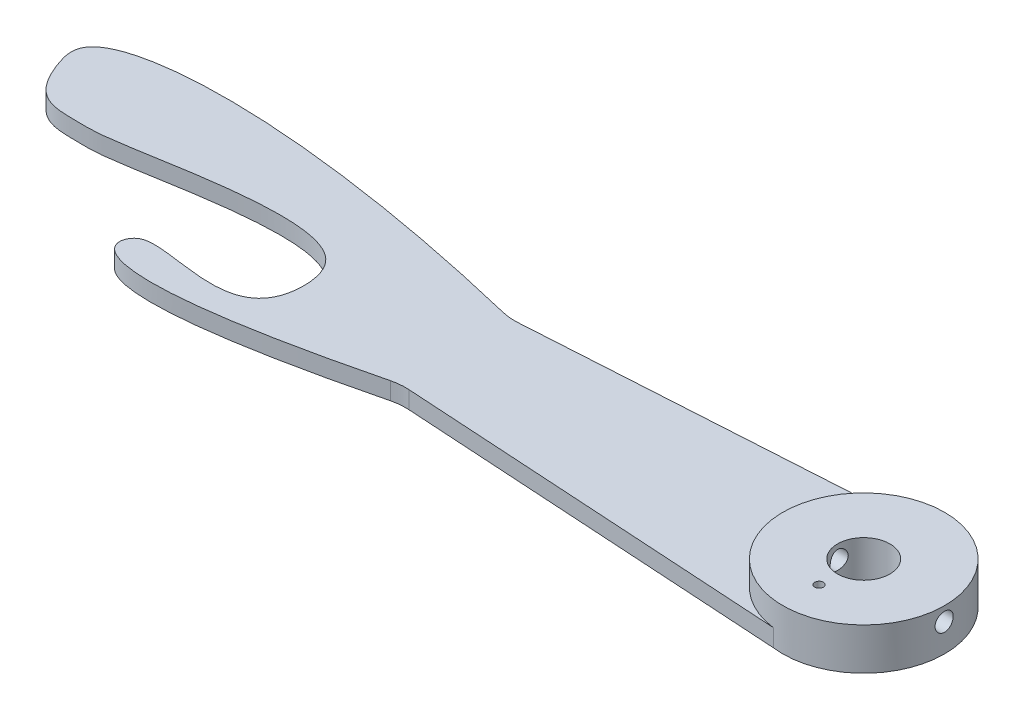
ISO-10303-21;
HEADER;
FILE_DESCRIPTION(('STEP AP214'),'2;1');
FILE_NAME('part.step','',(''),(''),'','','');
FILE_SCHEMA(('AUTOMOTIVE_DESIGN { 1 0 10303 214 1 1 1 1 }'));
ENDSEC;
DATA;
#1=APPLICATION_CONTEXT('core data for automotive mechanical design processes');
#2=APPLICATION_PROTOCOL_DEFINITION('international standard','automotive_design',2000,#1);
#3=PRODUCT_CONTEXT('',#1,'mechanical');
#4=PRODUCT('Part','Part','',(#3));
#5=PRODUCT_RELATED_PRODUCT_CATEGORY('part','',(#4));
#6=PRODUCT_DEFINITION_FORMATION('','',#4);
#7=PRODUCT_DEFINITION_CONTEXT('part definition',#1,'design');
#8=PRODUCT_DEFINITION('design','',#6,#7);
#9=PRODUCT_DEFINITION_SHAPE('','',#8);
#10=(LENGTH_UNIT() NAMED_UNIT(*) SI_UNIT(.MILLI.,.METRE.));
#11=(NAMED_UNIT(*) PLANE_ANGLE_UNIT() SI_UNIT($,.RADIAN.));
#12=(NAMED_UNIT(*) SI_UNIT($,.STERADIAN.) SOLID_ANGLE_UNIT());
#13=UNCERTAINTY_MEASURE_WITH_UNIT(LENGTH_MEASURE(1.E-05),#10,'distance_accuracy_value','');
#14=(GEOMETRIC_REPRESENTATION_CONTEXT(3) GLOBAL_UNCERTAINTY_ASSIGNED_CONTEXT((#13)) GLOBAL_UNIT_ASSIGNED_CONTEXT((#10,
#11,#12)) REPRESENTATION_CONTEXT('',''));
#15=CARTESIAN_POINT('',(0.,0.,0.));
#16=DIRECTION('',(0.,0.,1.));
#17=DIRECTION('',(1.,0.,0.));
#18=AXIS2_PLACEMENT_3D('',#15,#16,#17);
#19=CARTESIAN_POINT('',(-45.2064522020592,1.5875,-7.42970056120093));
#20=CARTESIAN_POINT('',(-68.7385230658082,1.5875,-1.55220301449873));
#21=CARTESIAN_POINT('',(-69.2548977062567,1.5875,-6.74334430708416));
#22=CARTESIAN_POINT('',(-65.4032652880408,1.5875,-8.16874151774842));
#23=CARTESIAN_POINT('',(-55.6776328197433,1.5875,-4.25533451918402));
#24=CARTESIAN_POINT('',(-57.3220849406949,1.5875,-18.1406564123138));
#25=CARTESIAN_POINT('',(-75.9393371187743,1.5875,-13.4654942069597));
#26=CARTESIAN_POINT('',(-81.606998932444,1.5875,-13.7017175286145));
#27=CARTESIAN_POINT('',(-84.3052630331315,1.5875,-13.4032317419072));
#28=CARTESIAN_POINT('',(-86.882917877035,1.5875,-22.6760988597324));
#29=CARTESIAN_POINT('',(-69.3318028641538,1.5875,-23.7112984969501));
#30=CARTESIAN_POINT('',(-45.4543996597082,1.5875,-17.9520244146589));
#31=B_SPLINE_CURVE_WITH_KNOTS('',3,(#19,#20,#21,#22,#23,#24,#25,#26,#27,#28,#29,#30),
.UNSPECIFIED.,.F.,.F.,(4,1,1,1,1,1,1,1,1,4),(0.00152699221827778,0.145525509120552,
0.192265368960274,0.438185565987141,0.489914764133591,0.657828152278324,0.698156079835028,
0.852866112143922,0.884867633334752,0.99883253770472),.UNSPECIFIED.);
#32=DIRECTION('',(0.,-1.,0.));
#33=VECTOR('',#32,1.);
#34=SURFACE_OF_LINEAR_EXTRUSION('',#31,#33);
#35=CARTESIAN_POINT('',(-45.2064522020592,0.,-7.42970056120093));
#36=CARTESIAN_POINT('',(-68.7385230658082,0.,-1.55220301449873));
#37=CARTESIAN_POINT('',(-69.2548977062567,0.,-6.74334430708416));
#38=CARTESIAN_POINT('',(-65.4032652880408,0.,-8.16874151774842));
#39=CARTESIAN_POINT('',(-55.6776328197433,0.,-4.25533451918402));
#40=CARTESIAN_POINT('',(-57.3220849406949,0.,-18.1406564123138));
#41=CARTESIAN_POINT('',(-75.9393371187743,0.,-13.4654942069597));
#42=CARTESIAN_POINT('',(-81.606998932444,0.,-13.7017175286145));
#43=CARTESIAN_POINT('',(-84.3052630331315,0.,-13.4032317419072));
#44=CARTESIAN_POINT('',(-86.882917877035,0.,-22.6760988597324));
#45=CARTESIAN_POINT('',(-69.3318028641538,0.,-23.7112984969501));
#46=CARTESIAN_POINT('',(-45.4543996597082,0.,-17.9520244146589));
#47=B_SPLINE_CURVE_WITH_KNOTS('',3,(#35,#36,#37,#38,#39,#40,#41,#42,#43,#44,#45,#46),
.UNSPECIFIED.,.F.,.F.,(4,1,1,1,1,1,1,1,1,4),(0.00152699221827778,0.145525509120552,
0.192265368960274,0.438185565987141,0.489914764133591,0.657828152278324,0.698156079835028,
0.852866112143922,0.884867633334752,0.99883253770472),.UNSPECIFIED.);
#48=CARTESIAN_POINT('',(-45.2064522020592,0.,-7.42970056120093));
#49=VERTEX_POINT('',#48);
#50=CARTESIAN_POINT('',(-45.4543996597082,0.,-17.9520244146589));
#51=VERTEX_POINT('',#50);
#52=EDGE_CURVE('E122',#49,#51,#47,.T.);
#53=ORIENTED_EDGE('',*,*,#52,.F.);
#54=DIRECTION('',(0.,-1.,0.));
#55=VECTOR('',#54,1.);
#56=CARTESIAN_POINT('',(-45.2064522020592,1.5875,-7.42970056120093));
#57=LINE('',#56,#55);
#58=CARTESIAN_POINT('',(-45.2064522020592,1.5875,-7.42970056120093));
#59=VERTEX_POINT('',#58);
#60=EDGE_CURVE('E12',#59,#49,#57,.T.);
#61=ORIENTED_EDGE('',*,*,#60,.F.);
#62=CARTESIAN_POINT('',(-45.4543996597082,1.5875,-17.9520244146589));
#63=VERTEX_POINT('',#62);
#64=EDGE_CURVE('E175',#59,#63,#31,.T.);
#65=ORIENTED_EDGE('',*,*,#64,.T.);
#66=DIRECTION('',(0.,-1.,0.));
#67=VECTOR('',#66,1.);
#68=CARTESIAN_POINT('',(-45.4543996597082,1.5875,-17.9520244146589));
#69=LINE('',#68,#67);
#70=EDGE_CURVE('E151',#63,#51,#69,.T.);
#71=ORIENTED_EDGE('',*,*,#70,.T.);
#72=EDGE_LOOP('',(#53,#61,#65,#71));
#73=FACE_BOUND('',#72,.T.);
#74=ADVANCED_FACE('F45',(#73),#34,.T.);
#75=CARTESIAN_POINT('',(-43.9754594012535,1.5875,-2.50110474450379));
#76=DIRECTION('',(0.,-1.,0.));
#77=DIRECTION('',(0.,0.,-1.));
#78=AXIS2_PLACEMENT_3D('',#75,#76,#77);
#79=CYLINDRICAL_SURFACE('',#78,5.08);
#80=CARTESIAN_POINT('',(-43.9754594012535,0.,-2.50110474450379));
#81=DIRECTION('',(0.,1.,0.));
#82=DIRECTION('',(0.,0.,1.));
#83=AXIS2_PLACEMENT_3D('',#80,#81,#82);
#84=CIRCLE('',#83,5.08);
#85=CARTESIAN_POINT('',(-43.6629020064214,0.,-7.5714802606698));
#86=VERTEX_POINT('',#85);
#87=EDGE_CURVE('E157',#49,#86,#84,.F.);
#88=ORIENTED_EDGE('',*,*,#87,.T.);
#89=DIRECTION('',(0.,-1.,0.));
#90=VECTOR('',#89,1.);
#91=CARTESIAN_POINT('',(-43.6629020064214,1.5875,-7.5714802606698));
#92=LINE('',#91,#90);
#93=CARTESIAN_POINT('',(-43.6629020064214,1.5875,-7.5714802606698));
#94=VERTEX_POINT('',#93);
#95=EDGE_CURVE('E60',#94,#86,#92,.T.);
#96=ORIENTED_EDGE('',*,*,#95,.F.);
#97=CARTESIAN_POINT('',(-43.9754594012535,1.5875,-2.50110474450379));
#98=DIRECTION('',(0.,1.,0.));
#99=DIRECTION('',(0.,0.,1.));
#100=AXIS2_PLACEMENT_3D('',#97,#98,#99);
#101=CIRCLE('',#100,5.08);
#102=EDGE_CURVE('E110',#59,#94,#101,.F.);
#103=ORIENTED_EDGE('',*,*,#102,.F.);
#104=ORIENTED_EDGE('',*,*,#60,.T.);
#105=EDGE_LOOP('',(#88,#96,#103,#104));
#106=FACE_BOUND('',#105,.T.);
#107=ADVANCED_FACE('F380',(#106),#79,.F.);
#108=CARTESIAN_POINT('',(0.299678926952375,1.5875,-4.86145814833854));
#109=DIRECTION('',(0.0615270462268013,0.,-0.998105416568112));
#110=DIRECTION('',(-0.998105416568112,0.,-0.0615270462268013));
#111=AXIS2_PLACEMENT_3D('',#108,#109,#110);
#112=PLANE('',#111);
#113=DIRECTION('',(0.998105416568112,0.,0.0615270462268013));
#114=VECTOR('',#113,1.);
#115=CARTESIAN_POINT('',(0.299678926952375,0.,-4.86145814833854));
#116=LINE('',#115,#114);
#117=CARTESIAN_POINT('',(-8.27069916343413,0.,-5.38976912651305));
#118=VERTEX_POINT('',#117);
#119=EDGE_CURVE('E120',#86,#118,#116,.T.);
#120=ORIENTED_EDGE('',*,*,#119,.T.);
#121=DIRECTION('',(0.,-1.,0.));
#122=VECTOR('',#121,1.);
#123=CARTESIAN_POINT('',(-8.27069916343413,3.81,-5.38976912651305));
#124=LINE('',#123,#122);
#125=CARTESIAN_POINT('',(-8.27069916343413,1.5875,-5.38976912651305));
#126=VERTEX_POINT('',#125);
#127=EDGE_CURVE('E118',#118,#126,#124,.F.);
#128=ORIENTED_EDGE('',*,*,#127,.T.);
#129=DIRECTION('',(0.998105416568112,0.,0.0615270462268013));
#130=VECTOR('',#129,1.);
#131=CARTESIAN_POINT('',(0.299678926952375,1.5875,-4.86145814833854));
#132=LINE('',#131,#130);
#133=EDGE_CURVE('E105',#94,#126,#132,.T.);
#134=ORIENTED_EDGE('',*,*,#133,.F.);
#135=ORIENTED_EDGE('',*,*,#95,.T.);
#136=EDGE_LOOP('',(#120,#128,#134,#135));
#137=FACE_BOUND('',#136,.T.);
#138=ADVANCED_FACE('F119',(#137),#112,.F.);
#139=CARTESIAN_POINT('',(-7.366,1.5875,-12.7));
#140=DIRECTION('',(0.,-1.,0.));
#141=DIRECTION('',(0.,0.,-1.));
#142=AXIS2_PLACEMENT_3D('',#139,#140,#141);
#143=CYLINDRICAL_SURFACE('',#142,7.366);
#144=CARTESIAN_POINT('',(-14.6855973762223,2.54,-13.5255));
#145=CARTESIAN_POINT('',(-14.6855979782766,2.5862122176924,-13.5254980141274));
#146=CARTESIAN_POINT('',(-14.6860397375811,2.63245423075994,-13.521606418294));
#147=CARTESIAN_POINT('',(-14.6877586065931,2.72365397752181,-13.5061421078971));
#148=CARTESIAN_POINT('',(-14.6890366151641,2.7686102749013,-13.4945611280076));
#149=CARTESIAN_POINT('',(-14.6922814465688,2.85590480654257,-13.4640614459201));
#150=CARTESIAN_POINT('',(-14.6942478290321,2.89824469426347,-13.4451474340205));
#151=CARTESIAN_POINT('',(-14.6986473102254,2.97914058466141,-13.4005280886547));
#152=CARTESIAN_POINT('',(-14.7010803221323,3.01769728924068,-13.3748240182427));
#153=CARTESIAN_POINT('',(-14.7061512624519,3.09011548599148,-13.3172293601897));
#154=CARTESIAN_POINT('',(-14.7087899782837,3.12395740000604,-13.2853142222058));
#155=CARTESIAN_POINT('',(-14.7139678956606,3.18581652611943,-13.2162560618126));
#156=CARTESIAN_POINT('',(-14.71650709247,3.2138334613045,-13.1791127910038));
#157=CARTESIAN_POINT('',(-14.7212077996832,3.26331631785724,-13.1005311761301));
#158=CARTESIAN_POINT('',(-14.7233682930559,3.28476471088172,-13.0590817284511));
#159=CARTESIAN_POINT('',(-14.7270595514746,3.32038944988259,-12.9731411641375));
#160=CARTESIAN_POINT('',(-14.7285903355118,3.33456601516875,-12.9286501392791));
#161=CARTESIAN_POINT('',(-14.7308441602775,3.35518670528302,-12.8380884837005));
#162=CARTESIAN_POINT('',(-14.7315705814025,3.36166319878253,-12.7920253087231));
#163=CARTESIAN_POINT('',(-14.7321453520887,3.36680012960659,-12.6994605096559));
#164=CARTESIAN_POINT('',(-14.7319937297866,3.36546081738675,-12.6529588996633));
#165=CARTESIAN_POINT('',(-14.7308322492016,3.35503027678882,-12.5610571978174));
#166=CARTESIAN_POINT('',(-14.7298262446946,3.34597385658352,-12.5156530998215));
#167=CARTESIAN_POINT('',(-14.7270734161751,3.32042048984739,-12.4270133483639));
#168=CARTESIAN_POINT('',(-14.7253265804659,3.30392342583913,-12.3837777291515));
#169=CARTESIAN_POINT('',(-14.721281784899,3.26391942191542,-12.3005934069651));
#170=CARTESIAN_POINT('',(-14.7189826283644,3.24039723383743,-12.2606520975024));
#171=CARTESIAN_POINT('',(-14.7140908349429,3.18702177023156,-12.1852708471787));
#172=CARTESIAN_POINT('',(-14.7114981872365,3.15716826126497,-12.1498310723684));
#173=CARTESIAN_POINT('',(-14.7062931823566,3.09178218898632,-12.0842547334515));
#174=CARTESIAN_POINT('',(-14.7036807951666,3.05621931959844,-12.0541483817625));
#175=CARTESIAN_POINT('',(-14.6987448869194,2.98052865751006,-12.0003278138033));
#176=CARTESIAN_POINT('',(-14.6964213664776,2.94040085508462,-11.9766136111511));
#177=CARTESIAN_POINT('',(-14.6923261840253,2.8566945067779,-11.9362497972332));
#178=CARTESIAN_POINT('',(-14.6905546875046,2.81311493099971,-11.9196023039371));
#179=CARTESIAN_POINT('',(-14.6877674746198,2.72375471473303,-11.8938696859658));
#180=CARTESIAN_POINT('',(-14.6867517291765,2.67797415900471,-11.8847842703199));
#181=CARTESIAN_POINT('',(-14.6855962038138,2.58577748500813,-11.8744730940358));
#182=CARTESIAN_POINT('',(-14.6854517005643,2.53936616347168,-11.8732049521884));
#183=CARTESIAN_POINT('',(-14.6860425453782,2.44699211092224,-11.8784527814034));
#184=CARTESIAN_POINT('',(-14.6867778784432,2.40102937227595,-11.8849686197758));
#185=CARTESIAN_POINT('',(-14.6890412407153,2.31098231060184,-11.9055638866064));
#186=CARTESIAN_POINT('',(-14.6905671463374,2.26689329608804,-11.9196230562382));
#187=CARTESIAN_POINT('',(-14.694238003259,2.18169895179618,-11.9548851376294));
#188=CARTESIAN_POINT('',(-14.6963829722224,2.14059370719669,-11.9760882532318));
#189=CARTESIAN_POINT('',(-14.7010616553228,2.06234120357744,-12.0251416198696));
#190=CARTESIAN_POINT('',(-14.7035969877118,2.02521156460558,-12.0530198225298));
#191=CARTESIAN_POINT('',(-14.7087655369242,1.95614342745834,-12.1145921920756));
#192=CARTESIAN_POINT('',(-14.7113987567954,1.92420509108205,-12.1482865401673));
#193=CARTESIAN_POINT('',(-14.7164807614273,1.86627877749344,-12.2207191873155));
#194=CARTESIAN_POINT('',(-14.7189286523472,1.84031854002071,-12.259479742133));
#195=CARTESIAN_POINT('',(-14.7233510221194,1.7952767036032,-12.3408353825806));
#196=CARTESIAN_POINT('',(-14.7253255088777,1.77619498978584,-12.3834304041595));
#197=CARTESIAN_POINT('',(-14.7285745975419,1.74549832099015,-12.4711511572146));
#198=CARTESIAN_POINT('',(-14.7298507380147,1.73386694202589,-12.5162710820209));
#199=CARTESIAN_POINT('',(-14.7315656977312,1.71834758763597,-12.6078386090367));
#200=CARTESIAN_POINT('',(-14.7320045469667,1.71445933485104,-12.6542861636301));
#201=CARTESIAN_POINT('',(-14.7319954058595,1.71454108557878,-12.7469187535382));
#202=CARTESIAN_POINT('',(-14.7315522602673,1.71846815990525,-12.7931038331654));
#203=CARTESIAN_POINT('',(-14.7298385064783,1.7339786583521,-12.8841535212901));
#204=CARTESIAN_POINT('',(-14.7285678981344,1.74556208383393,-12.9290181295529));
#205=CARTESIAN_POINT('',(-14.7253414585588,1.7760438365449,-13.0161505532006));
#206=CARTESIAN_POINT('',(-14.7233857798587,1.7949405355645,-13.0584189441756));
#207=CARTESIAN_POINT('',(-14.719006539167,1.83950795076021,-13.1391911242864));
#208=CARTESIAN_POINT('',(-14.7165829760905,1.86517868264317,-13.177694904693));
#209=CARTESIAN_POINT('',(-14.7115231173204,1.92272561365091,-13.2500646742507));
#210=CARTESIAN_POINT('',(-14.7088857679289,1.95463379966722,-13.2839051554043));
#211=CARTESIAN_POINT('',(-14.7037043074677,2.02368477616371,-13.3457692078434));
#212=CARTESIAN_POINT('',(-14.7011602187776,2.06082881285048,-13.3737913903532));
#213=CARTESIAN_POINT('',(-14.6964448356879,2.13942769004026,-13.4232957240214));
#214=CARTESIAN_POINT('',(-14.6942747328883,2.18089565767575,-13.4447571332936));
#215=CARTESIAN_POINT('',(-14.6905670849453,2.26684621847608,-13.480382425112));
#216=CARTESIAN_POINT('',(-14.6890288382776,2.31132540412257,-13.4945544052519));
#217=CARTESIAN_POINT('',(-14.6871404667103,2.38670576295381,-13.5117283877451));
#218=CARTESIAN_POINT('',(-14.6865646097813,2.41712777831842,-13.5168855186082));
#219=CARTESIAN_POINT('',(-14.68579286481,2.47836211146436,-13.5237719774061));
#220=CARTESIAN_POINT('',(-14.6855969746257,2.50917442704452,-13.525501324664));
#221=CARTESIAN_POINT('',(-14.6855973762223,2.54,-13.5255));
#222=B_SPLINE_CURVE_WITH_KNOTS('',3,(#144,#145,#146,#147,#148,#149,#150,#151,#152,#153,#154,
#155,#156,#157,#158,#159,#160,#161,#162,#163,#164,#165,#166,#167,#168,#169,#170,#171,#172,#173,
#174,#175,#176,#177,#178,#179,#180,#181,#182,#183,#184,#185,#186,#187,#188,#189,#190,#191,#192,
#193,#194,#195,#196,#197,#198,#199,#200,#201,#202,#203,#204,#205,#206,#207,#208,#209,#210,#211,
#212,#213,#214,#215,#216,#217,#218,#219,#220,#221),.UNSPECIFIED.,.T.,.F.,(4,2,2,2,2,2,2,2,2,2,2,
2,2,2,2,2,2,2,2,2,2,2,2,2,2,2,2,2,2,2,2,2,2,2,2,2,2,2,4),(0.,0.138524065366138,
0.277197271953577,0.415781927374845,0.554340822071073,0.693458946503381,0.832583682962709,
0.972076506201927,1.11156512225426,1.25046527527703,1.38936097730228,1.52763348364485,
1.6659081731946,1.80448519911218,1.94306733531662,2.08241100883844,2.22175497921788,
2.36114068306456,2.50052102343348,2.63914504640114,2.77776670634268,2.91601792554613,
3.05427308989809,3.19311764059842,3.33196651788403,3.47144725549567,3.61092566364609,
3.75009552891002,3.88926040901067,4.02766297347767,4.16606556255543,4.30443735572488,
4.44280946973771,4.58191073554215,4.72104516549699,4.86061502525118,5.00002950462804,
5.09243164344824,5.18483326138089),.UNSPECIFIED.);
#223=CARTESIAN_POINT('',(-14.6855973762223,2.54,-13.5255));
#224=VERTEX_POINT('',#223);
#225=EDGE_CURVE('E335',#224,#224,#222,.T.);
#226=ORIENTED_EDGE('',*,*,#225,.T.);
#227=EDGE_LOOP('',(#226));
#228=FACE_BOUND('',#227,.T.);
#229=CARTESIAN_POINT('',(-0.046402623777724,2.54,-13.5255));
#230=CARTESIAN_POINT('',(-0.0464020217234188,2.49378778230759,-13.5254980141274));
#231=CARTESIAN_POINT('',(-0.0459602624188489,2.44754576924006,-13.521606418294));
#232=CARTESIAN_POINT('',(-0.0442413934068846,2.35634602247819,-13.5061421078971));
#233=CARTESIAN_POINT('',(-0.0429633848358541,2.3113897250987,-13.4945611280076));
#234=CARTESIAN_POINT('',(-0.0397185534311803,2.22409519345743,-13.4640614459201));
#235=CARTESIAN_POINT('',(-0.0377521709679085,2.18175530573653,-13.4451474340205));
#236=CARTESIAN_POINT('',(-0.0333526897745612,2.10085941533858,-13.4005280886547));
#237=CARTESIAN_POINT('',(-0.0309196778677017,2.06230271075932,-13.3748240182427));
#238=CARTESIAN_POINT('',(-0.025848737548075,1.98988451400852,-13.3172293601897));
#239=CARTESIAN_POINT('',(-0.0232100217162686,1.95604259999396,-13.2853142222058));
#240=CARTESIAN_POINT('',(-0.0180321043393894,1.89418347388057,-13.2162560618126));
#241=CARTESIAN_POINT('',(-0.0154929075300073,1.8661665386955,-13.1791127910038));
#242=CARTESIAN_POINT('',(-0.0107922003168011,1.81668368214276,-13.1005311761301));
#243=CARTESIAN_POINT('',(-0.00863170694413997,1.79523528911828,-13.0590817284511));
#244=CARTESIAN_POINT('',(-0.00494044852536426,1.75961055011741,-12.9731411641375));
#245=CARTESIAN_POINT('',(-0.00340966448823247,1.74543398483125,-12.9286501392791));
#246=CARTESIAN_POINT('',(-0.00115583972249881,1.72481329471698,-12.8380884837005));
#247=CARTESIAN_POINT('',(-0.00042941859751832,1.71833680121747,-12.7920253087231));
#248=CARTESIAN_POINT('',(0.000145352088703354,1.71319987039341,-12.6994605096559));
#249=CARTESIAN_POINT('',(-6.27021336403178E-06,1.71453918261325,-12.6529588996633));
#250=CARTESIAN_POINT('',(-0.00116775079838648,1.72496972321118,-12.5610571978174));
#251=CARTESIAN_POINT('',(-0.00217375530538939,1.73402614341647,-12.5156530998215));
#252=CARTESIAN_POINT('',(-0.00492658382492391,1.75957951015261,-12.4270133483639));
#253=CARTESIAN_POINT('',(-0.00667341953412491,1.77607657416087,-12.3837777291515));
#254=CARTESIAN_POINT('',(-0.0107182151010413,1.81608057808458,-12.3005934069651));
#255=CARTESIAN_POINT('',(-0.013017371635589,1.83960276616256,-12.2606520975024));
#256=CARTESIAN_POINT('',(-0.0179091650570856,1.89297822976844,-12.1852708471787));
#257=CARTESIAN_POINT('',(-0.0205018127635445,1.92283173873503,-12.1498310723684));
#258=CARTESIAN_POINT('',(-0.0257068176433876,1.98821781101368,-12.0842547334515));
#259=CARTESIAN_POINT('',(-0.0283192048334251,2.02378068040156,-12.0541483817625));
#260=CARTESIAN_POINT('',(-0.0332551130806329,2.09947134248993,-12.0003278138033));
#261=CARTESIAN_POINT('',(-0.0355786335223911,2.13959914491538,-11.9766136111511));
#262=CARTESIAN_POINT('',(-0.0396738159746939,2.2233054932221,-11.9362497972332));
#263=CARTESIAN_POINT('',(-0.041445312495424,2.26688506900029,-11.9196023039371));
#264=CARTESIAN_POINT('',(-0.0442325253801804,2.35624528526697,-11.8938696859658));
#265=CARTESIAN_POINT('',(-0.045248270823548,2.40202584099529,-11.8847842703199));
#266=CARTESIAN_POINT('',(-0.0464037961862436,2.49422251499187,-11.8744730940358));
#267=CARTESIAN_POINT('',(-0.0465482994356645,2.54063383652832,-11.8732049521884));
#268=CARTESIAN_POINT('',(-0.0459574546218456,2.63300788907775,-11.8784527814034));
#269=CARTESIAN_POINT('',(-0.0452221215567696,2.67897062772405,-11.8849686197758));
#270=CARTESIAN_POINT('',(-0.0429587592846507,2.76901768939816,-11.9055638866064));
#271=CARTESIAN_POINT('',(-0.0414328536625906,2.81310670391196,-11.9196230562382));
#272=CARTESIAN_POINT('',(-0.037761996740996,2.89830104820382,-11.9548851376294));
#273=CARTESIAN_POINT('',(-0.0356170277775641,2.93940629280331,-11.9760882532318));
#274=CARTESIAN_POINT('',(-0.030938344677193,3.01765879642255,-12.0251416198696));
#275=CARTESIAN_POINT('',(-0.0284030122881831,3.05478843539442,-12.0530198225298));
#276=CARTESIAN_POINT('',(-0.0232344630757711,3.12385657254165,-12.1145921920756));
#277=CARTESIAN_POINT('',(-0.0206012432046185,3.15579490891795,-12.1482865401673));
#278=CARTESIAN_POINT('',(-0.0155192385726669,3.21372122250656,-12.2207191873155));
#279=CARTESIAN_POINT('',(-0.0130713476528446,3.23968145997929,-12.259479742133));
#280=CARTESIAN_POINT('',(-0.00864897788055262,3.2847232963968,-12.3408353825806));
#281=CARTESIAN_POINT('',(-0.006674491122333,3.30380501021416,-12.3834304041595));
#282=CARTESIAN_POINT('',(-0.00342540245808032,3.33450167900985,-12.4711511572146));
#283=CARTESIAN_POINT('',(-0.0021492619853141,3.34613305797411,-12.5162710820209));
#284=CARTESIAN_POINT('',(-0.000434302268805996,3.36165241236403,-12.6078386090367));
#285=CARTESIAN_POINT('',(4.54696673869728E-06,3.36554066514896,-12.6542861636301));
#286=CARTESIAN_POINT('',(-4.59414046889261E-06,3.36545891442122,-12.7469187535382));
#287=CARTESIAN_POINT('',(-0.000447739732687645,3.36153184009474,-12.7931038331654));
#288=CARTESIAN_POINT('',(-0.00216149352168424,3.3460213416479,-12.8841535212901));
#289=CARTESIAN_POINT('',(-0.0034321018656016,3.33443791616607,-12.9290181295529));
#290=CARTESIAN_POINT('',(-0.00665854144120797,3.30395616345509,-13.0161505532006));
#291=CARTESIAN_POINT('',(-0.00861422014130007,3.2850594644355,-13.0584189441756));
#292=CARTESIAN_POINT('',(-0.0129934608330026,3.24049204923979,-13.1391911242864));
#293=CARTESIAN_POINT('',(-0.015417023909486,3.21482131735683,-13.177694904693));
#294=CARTESIAN_POINT('',(-0.0204768826796045,3.15727438634909,-13.2500646742507));
#295=CARTESIAN_POINT('',(-0.0231142320710768,3.12536620033278,-13.2839051554043));
#296=CARTESIAN_POINT('',(-0.0282956925322658,3.05631522383629,-13.3457692078434));
#297=CARTESIAN_POINT('',(-0.0308397812224376,3.01917118714951,-13.3737913903532));
#298=CARTESIAN_POINT('',(-0.0355551643121466,2.94057230995974,-13.4232957240214));
#299=CARTESIAN_POINT('',(-0.037725267111702,2.89910434232425,-13.4447571332936));
#300=CARTESIAN_POINT('',(-0.0414329150546554,2.81315378152391,-13.480382425112));
#301=CARTESIAN_POINT('',(-0.0429711617224292,2.76867459587743,-13.4945544052519));
#302=CARTESIAN_POINT('',(-0.044859533289741,2.69329423704619,-13.5117283877451));
#303=CARTESIAN_POINT('',(-0.0454353902186924,2.66287222168158,-13.5168855186082));
#304=CARTESIAN_POINT('',(-0.04620713519001,2.60163788853564,-13.5237719774061));
#305=CARTESIAN_POINT('',(-0.0464030253743111,2.57082557295548,-13.525501324664));
#306=CARTESIAN_POINT('',(-0.046402623777724,2.54,-13.5255));
#307=B_SPLINE_CURVE_WITH_KNOTS('',3,(#229,#230,#231,#232,#233,#234,#235,#236,#237,#238,#239,
#240,#241,#242,#243,#244,#245,#246,#247,#248,#249,#250,#251,#252,#253,#254,#255,#256,#257,#258,
#259,#260,#261,#262,#263,#264,#265,#266,#267,#268,#269,#270,#271,#272,#273,#274,#275,#276,#277,
#278,#279,#280,#281,#282,#283,#284,#285,#286,#287,#288,#289,#290,#291,#292,#293,#294,#295,#296,
#297,#298,#299,#300,#301,#302,#303,#304,#305,#306),.UNSPECIFIED.,.T.,.F.,(4,2,2,2,2,2,2,2,2,2,2,
2,2,2,2,2,2,2,2,2,2,2,2,2,2,2,2,2,2,2,2,2,2,2,2,2,2,2,4),(0.,0.138524065366138,
0.277197271953577,0.415781927374844,0.554340822071072,0.693458946503379,0.832583682962709,
0.972076506201927,1.11156512225426,1.25046527527703,1.38936097730228,1.52763348364485,
1.6659081731946,1.80448519911218,1.94306733531662,2.08241100883843,2.22175497921788,
2.36114068306457,2.50052102343348,2.63914504640114,2.77776670634268,2.91601792554613,
3.05427308989809,3.19311764059842,3.33196651788403,3.47144725549567,3.61092566364609,
3.75009552891002,3.88926040901067,4.02766297347766,4.16606556255543,4.30443735572488,
4.44280946973771,4.58191073554215,4.72104516549699,4.86061502525119,5.00002950462804,
5.09243164344824,5.18483326138089),.UNSPECIFIED.);
#308=CARTESIAN_POINT('',(-0.046402623777724,2.54,-13.5255));
#309=VERTEX_POINT('',#308);
#310=EDGE_CURVE('E327',#309,#309,#307,.T.);
#311=ORIENTED_EDGE('',*,*,#310,.T.);
#312=EDGE_LOOP('',(#311));
#313=FACE_BOUND('',#312,.T.);
#314=ORIENTED_EDGE('',*,*,#127,.F.);
#315=CARTESIAN_POINT('',(-7.366,0.,-12.7));
#316=DIRECTION('',(0.,1.,0.));
#317=DIRECTION('',(0.,0.,1.));
#318=AXIS2_PLACEMENT_3D('',#315,#316,#317);
#319=CIRCLE('',#318,7.366);
#320=CARTESIAN_POINT('',(-8.26701750102089,0.,-20.0106855672265));
#321=VERTEX_POINT('',#320);
#322=EDGE_CURVE('E76',#118,#321,#319,.T.);
#323=ORIENTED_EDGE('',*,*,#322,.T.);
#324=DIRECTION('',(0.,-1.,0.));
#325=VECTOR('',#324,1.);
#326=CARTESIAN_POINT('',(-8.26701750102094,3.81,-20.0106855672265));
#327=LINE('',#326,#325);
#328=CARTESIAN_POINT('',(-8.26701750102089,1.5875,-20.0106855672265));
#329=VERTEX_POINT('',#328);
#330=EDGE_CURVE('E123',#321,#329,#327,.F.);
#331=ORIENTED_EDGE('',*,*,#330,.T.);
#332=CARTESIAN_POINT('',(-7.366,1.5875,-12.7));
#333=DIRECTION('',(0.,1.,0.));
#334=DIRECTION('',(0.,0.,1.));
#335=AXIS2_PLACEMENT_3D('',#332,#333,#334);
#336=CIRCLE('',#335,7.366);
#337=EDGE_CURVE('E68',#329,#126,#336,.T.);
#338=ORIENTED_EDGE('',*,*,#337,.T.);
#339=EDGE_LOOP('',(#314,#323,#331,#338));
#340=FACE_BOUND('',#339,.T.);
#341=CARTESIAN_POINT('',(-7.366,3.81,-12.7));
#342=DIRECTION('',(0.,-1.,0.));
#343=DIRECTION('',(0.,0.,-1.));
#344=AXIS2_PLACEMENT_3D('',#341,#342,#343);
#345=CIRCLE('',#344,7.366);
#346=CARTESIAN_POINT('',(-7.366,3.81,-20.066));
#347=VERTEX_POINT('',#346);
#348=EDGE_CURVE('E129',#347,#347,#345,.T.);
#349=ORIENTED_EDGE('',*,*,#348,.T.);
#350=EDGE_LOOP('',(#349));
#351=FACE_BOUND('',#350,.T.);
#352=ADVANCED_FACE('F126',(#228,#313,#340,#351),#143,.T.);
#353=CARTESIAN_POINT('',(-1.2549051919152,1.5875,-20.4411666782845));
#354=DIRECTION('',(-0.0612757134450967,0.,-0.998120877921003));
#355=DIRECTION('',(-0.998120877921003,0.,0.0612757134450967));
#356=AXIS2_PLACEMENT_3D('',#353,#354,#355);
#357=PLANE('',#356);
#358=ORIENTED_EDGE('',*,*,#330,.F.);
#359=DIRECTION('',(0.998120877921003,0.,-0.0612757134450967));
#360=VECTOR('',#359,1.);
#361=CARTESIAN_POINT('',(-1.2549051919152,0.,-20.4411666782845));
#362=LINE('',#361,#360);
#363=CARTESIAN_POINT('',(-43.9519732107189,0.,-17.8199477831187));
#364=VERTEX_POINT('',#363);
#365=EDGE_CURVE('E397',#364,#321,#362,.T.);
#366=ORIENTED_EDGE('',*,*,#365,.F.);
#367=DIRECTION('',(0.,-1.,0.));
#368=VECTOR('',#367,1.);
#369=CARTESIAN_POINT('',(-43.9519732107189,1.5875,-17.8199477831187));
#370=LINE('',#369,#368);
#371=CARTESIAN_POINT('',(-43.9519732107189,1.5875,-17.8199477831187));
#372=VERTEX_POINT('',#371);
#373=EDGE_CURVE('E180',#372,#364,#370,.T.);
#374=ORIENTED_EDGE('',*,*,#373,.F.);
#375=DIRECTION('',(0.998120877921003,0.,-0.0612757134450967));
#376=VECTOR('',#375,1.);
#377=CARTESIAN_POINT('',(-1.2549051919152,1.5875,-20.4411666782845));
#378=LINE('',#377,#376);
#379=EDGE_CURVE('E115',#372,#329,#378,.T.);
#380=ORIENTED_EDGE('',*,*,#379,.T.);
#381=EDGE_LOOP('',(#358,#366,#374,#380));
#382=FACE_BOUND('',#381,.T.);
#383=ADVANCED_FACE('F371',(#382),#357,.T.);
#384=CARTESIAN_POINT('',(-44.2632538350201,1.5875,-22.8904018429574));
#385=DIRECTION('',(0.,-1.,0.));
#386=DIRECTION('',(0.,0.,-1.));
#387=AXIS2_PLACEMENT_3D('',#384,#385,#386);
#388=CYLINDRICAL_SURFACE('',#387,5.08000000000001);
#389=CARTESIAN_POINT('',(-44.2632538350201,0.,-22.8904018429574));
#390=DIRECTION('',(0.,1.,0.));
#391=DIRECTION('',(0.,0.,1.));
#392=AXIS2_PLACEMENT_3D('',#389,#390,#391);
#393=CIRCLE('',#392,5.08000000000001);
#394=EDGE_CURVE('E176',#364,#51,#393,.F.);
#395=ORIENTED_EDGE('',*,*,#394,.T.);
#396=ORIENTED_EDGE('',*,*,#70,.F.);
#397=CARTESIAN_POINT('',(-44.2632538350201,1.5875,-22.8904018429574));
#398=DIRECTION('',(0.,1.,0.));
#399=DIRECTION('',(0.,0.,1.));
#400=AXIS2_PLACEMENT_3D('',#397,#398,#399);
#401=CIRCLE('',#400,5.08000000000001);
#402=EDGE_CURVE('E147',#372,#63,#401,.F.);
#403=ORIENTED_EDGE('',*,*,#402,.F.);
#404=ORIENTED_EDGE('',*,*,#373,.T.);
#405=EDGE_LOOP('',(#395,#396,#403,#404));
#406=FACE_BOUND('',#405,.T.);
#407=ADVANCED_FACE('F366',(#406),#388,.F.);
#408=CARTESIAN_POINT('',(-7.366,1.5875,-12.7));
#409=DIRECTION('',(0.,-1.,0.));
#410=DIRECTION('',(0.,0.,-1.));
#411=AXIS2_PLACEMENT_3D('',#408,#409,#410);
#412=CYLINDRICAL_SURFACE('',#411,2.38125);
#413=CARTESIAN_POINT('',(-9.59958485679412,2.54,-13.5255));
#414=CARTESIAN_POINT('',(-9.599584348877,2.584846479998,-13.5255006119028));
#415=CARTESIAN_POINT('',(-9.60095025515379,2.62968870383526,-13.5218331715296));
#416=CARTESIAN_POINT('',(-9.60623493389232,2.71803730266746,-13.5073150063685));
#417=CARTESIAN_POINT('',(-9.61015395937798,2.76154354481395,-13.4964635696174));
#418=CARTESIAN_POINT('',(-9.62004876523,2.84592445924302,-13.4680103064533));
#419=CARTESIAN_POINT('',(-9.62602024253253,2.88680442649069,-13.4504225942142));
#420=CARTESIAN_POINT('',(-9.63934065474778,2.96504774583488,-13.4090448513487));
#421=CARTESIAN_POINT('',(-9.64668993069641,3.00241022382743,-13.3852532845587));
#422=CARTESIAN_POINT('',(-9.66228691737693,3.07414067571219,-13.331063612462));
#423=CARTESIAN_POINT('',(-9.67055831719001,3.10833810759862,-13.3004465237202));
#424=CARTESIAN_POINT('',(-9.68686817623573,3.17123056351566,-13.233941418491));
#425=CARTESIAN_POINT('',(-9.69490659431135,3.19992462032508,-13.1980524774263));
#426=CARTESIAN_POINT('',(-9.71012129075442,3.25178414323012,-13.1207607328625));
#427=CARTESIAN_POINT('',(-9.71726649173125,3.27476886143975,-13.0792299949735));
#428=CARTESIAN_POINT('',(-9.7296088515206,3.31335721114358,-12.9926008990994));
#429=CARTESIAN_POINT('',(-9.73480658103953,3.32896300538284,-12.9475035909967));
#430=CARTESIAN_POINT('',(-9.74250045682695,3.35176613400821,-12.8568111360827));
#431=CARTESIAN_POINT('',(-9.74509035608913,3.35925606642685,-12.8112976622334));
#432=CARTESIAN_POINT('',(-9.74761068244465,3.36654742359773,-12.7195911186507));
#433=CARTESIAN_POINT('',(-9.74754184976345,3.36635098833423,-12.6733982416521));
#434=CARTESIAN_POINT('',(-9.74481480826212,3.35845611367453,-12.5837231896711));
#435=CARTESIAN_POINT('',(-9.74226645371892,3.35107594142018,-12.5402090972184));
#436=CARTESIAN_POINT('',(-9.73500652548634,3.32955218431885,-12.4550803850403));
#437=CARTESIAN_POINT('',(-9.73029480246567,3.31540813257735,-12.4134658966572));
#438=CARTESIAN_POINT('',(-9.71910262531287,3.28058436892362,-12.3326471803351));
#439=CARTESIAN_POINT('',(-9.71259889137384,3.25981802613524,-12.2934836375825));
#440=CARTESIAN_POINT('',(-9.69849394591574,3.2124120300398,-12.2191063830795));
#441=CARTESIAN_POINT('',(-9.69089241268712,3.18577065384685,-12.1838938345596));
#442=CARTESIAN_POINT('',(-9.67493327499919,3.12578818035054,-12.1165295344595));
#443=CARTESIAN_POINT('',(-9.66655687679618,3.09217605440545,-12.0846232038915));
#444=CARTESIAN_POINT('',(-9.65031159225858,3.02001270149875,-12.0268166025919));
#445=CARTESIAN_POINT('',(-9.64244279818501,2.98146058043588,-12.0009174214989));
#446=CARTESIAN_POINT('',(-9.62799578390098,2.899676010065,-11.955482317035));
#447=CARTESIAN_POINT('',(-9.6214410382984,2.85637674795661,-11.9360586147381));
#448=CARTESIAN_POINT('',(-9.61063517620463,2.76683654618856,-11.9048646330617));
#449=CARTESIAN_POINT('',(-9.60638299902991,2.7205969719786,-11.8930908292382));
#450=CARTESIAN_POINT('',(-9.60090682851947,2.62888204813095,-11.8780484267858));
#451=CARTESIAN_POINT('',(-9.59954642213133,2.58347775965773,-11.8743962920888));
#452=CARTESIAN_POINT('',(-9.59962493137689,2.49269442538135,-11.8746081451656));
#453=CARTESIAN_POINT('',(-9.60106328382427,2.44731537633735,-11.8784706207955));
#454=CARTESIAN_POINT('',(-9.60644042780994,2.35968130069791,-11.893256348066));
#455=CARTESIAN_POINT('',(-9.61028158566254,2.31737315773685,-11.9039041910294));
#456=CARTESIAN_POINT('',(-9.61992152100003,2.2351555754327,-11.9316230341984));
#457=CARTESIAN_POINT('',(-9.62572066292443,2.19524658427394,-11.9486952302365));
#458=CARTESIAN_POINT('',(-9.63886414094434,2.11747152281084,-11.9894287060324));
#459=CARTESIAN_POINT('',(-9.64625387607216,2.07971926281579,-12.0132922347298));
#460=CARTESIAN_POINT('',(-9.6616615741262,2.00861700442968,-12.0667062342543));
#461=CARTESIAN_POINT('',(-9.66967973608781,1.97526840981958,-12.0962585111722));
#462=CARTESIAN_POINT('',(-9.68595197864329,1.91210105922927,-12.1620590379833));
#463=CARTESIAN_POINT('',(-9.69419621510672,1.88256104021807,-12.1985781390769));
#464=CARTESIAN_POINT('',(-9.70957850737136,1.83000566802032,-12.2762585279787));
#465=CARTESIAN_POINT('',(-9.71671659193995,1.80699014514005,-12.317419695014));
#466=CARTESIAN_POINT('',(-9.7290560535115,1.76833470706333,-12.403055627642));
#467=CARTESIAN_POINT('',(-9.73426858683941,1.7526521604479,-12.44750945483));
#468=CARTESIAN_POINT('',(-9.74221616173324,1.72905804178986,-12.5386418723827));
#469=CARTESIAN_POINT('',(-9.74495217927317,1.72114340837437,-12.5853195786947));
#470=CARTESIAN_POINT('',(-9.74755887726791,1.71360269559184,-12.6770351520636));
#471=CARTESIAN_POINT('',(-9.74756739400137,1.71357789794922,-12.7220366553644));
#472=CARTESIAN_POINT('',(-9.74506367090028,1.72082103069081,-12.8113729170757));
#473=CARTESIAN_POINT('',(-9.74255166441358,1.7280882859831,-12.8557077368216));
#474=CARTESIAN_POINT('',(-9.73534384377007,1.74943893543822,-12.9416367308056));
#475=CARTESIAN_POINT('',(-9.73068893383058,1.76339485153589,-12.98326626026));
#476=CARTESIAN_POINT('',(-9.71967551786912,1.79760618580955,-13.0636055599843));
#477=CARTESIAN_POINT('',(-9.71331669656339,1.81786276994318,-13.1023147881948));
#478=CARTESIAN_POINT('',(-9.69923828031516,1.86500076522104,-13.1773519348702));
#479=CARTESIAN_POINT('',(-9.6914755114046,1.89210842621068,-13.2135295018748));
#480=CARTESIAN_POINT('',(-9.67555625871502,1.95180328434297,-13.280950621957));
#481=CARTESIAN_POINT('',(-9.66739964488872,1.98439230036851,-13.3121925305352));
#482=CARTESIAN_POINT('',(-9.65118787890593,2.05580875679081,-13.37023598276));
#483=CARTESIAN_POINT('',(-9.64315240373767,2.09484518183809,-13.3967867635746));
#484=CARTESIAN_POINT('',(-9.62851624845259,2.17707918903835,-13.4429405640628));
#485=CARTESIAN_POINT('',(-9.62191534289388,2.22027611582849,-13.4625446757077));
#486=CARTESIAN_POINT('',(-9.61109193072686,2.30885004632624,-13.4938420948501));
#487=CARTESIAN_POINT('',(-9.60682861854882,2.3541735804347,-13.5056718930067));
#488=CARTESIAN_POINT('',(-9.60107593791328,2.44633339235722,-13.5214988569191));
#489=CARTESIAN_POINT('',(-9.59958538718709,2.49316901676562,-13.5254993610199));
#490=CARTESIAN_POINT('',(-9.59958485679412,2.54,-13.5255));
#491=B_SPLINE_CURVE_WITH_KNOTS('',3,(#413,#414,#415,#416,#417,#418,#419,#420,#421,#422,#423,
#424,#425,#426,#427,#428,#429,#430,#431,#432,#433,#434,#435,#436,#437,#438,#439,#440,#441,#442,
#443,#444,#445,#446,#447,#448,#449,#450,#451,#452,#453,#454,#455,#456,#457,#458,#459,#460,#461,
#462,#463,#464,#465,#466,#467,#468,#469,#470,#471,#472,#473,#474,#475,#476,#477,#478,#479,#480,
#481,#482,#483,#484,#485,#486,#487,#488,#489,#490),.UNSPECIFIED.,.T.,.F.,(4,2,2,2,2,2,2,2,2,2,2,
2,2,2,2,2,2,2,2,2,2,2,2,2,2,2,2,2,2,2,2,2,2,2,2,2,2,2,4),(0.,0.134365717862045,
0.268744753908753,0.402843759206123,0.53697600092935,0.676269433732598,0.815587325044898,
0.958873370615834,1.10211739331488,1.24000507083889,1.37785435892194,1.50986197193037,
1.64187869842613,1.77569862261012,1.909557842534,2.05019817467722,2.19086399769236,
2.33385424169246,2.47677856074727,2.61279572341214,2.74878551855864,2.87957956521892,
3.01039797000301,3.14561498779902,3.28087500595405,3.42326506544474,3.56565142121428,
3.70719937093629,3.84869151348651,3.98303205674761,4.11736016402541,4.2492242064712,
4.38111266528835,4.51811061024443,4.65515410536253,4.79813004737588,4.94108350451722,
5.08145491093895,5.22176645112569),.UNSPECIFIED.);
#492=CARTESIAN_POINT('',(-9.59958485679412,2.54,-13.5255));
#493=VERTEX_POINT('',#492);
#494=EDGE_CURVE('E49',#493,#493,#491,.T.);
#495=ORIENTED_EDGE('',*,*,#494,.F.);
#496=EDGE_LOOP('',(#495));
#497=FACE_BOUND('',#496,.T.);
#498=CARTESIAN_POINT('',(-5.13241514320588,2.54,-13.5255));
#499=CARTESIAN_POINT('',(-5.132415651123,2.495153520002,-13.5255006119028));
#500=CARTESIAN_POINT('',(-5.13104974484621,2.45031129616474,-13.5218331715296));
#501=CARTESIAN_POINT('',(-5.12576506610768,2.36196269733254,-13.5073150063685));
#502=CARTESIAN_POINT('',(-5.12184604062201,2.31845645518604,-13.4964635696174));
#503=CARTESIAN_POINT('',(-5.11195123477,2.23407554075698,-13.4680103064533));
#504=CARTESIAN_POINT('',(-5.10597975746747,2.19319557350931,-13.4504225942142));
#505=CARTESIAN_POINT('',(-5.09265934525222,2.11495225416512,-13.4090448513487));
#506=CARTESIAN_POINT('',(-5.08531006930359,2.07758977617256,-13.3852532845587));
#507=CARTESIAN_POINT('',(-5.06971308262307,2.00585932428781,-13.331063612462));
#508=CARTESIAN_POINT('',(-5.06144168280999,1.97166189240137,-13.3004465237202));
#509=CARTESIAN_POINT('',(-5.04513182376427,1.90876943648434,-13.233941418491));
#510=CARTESIAN_POINT('',(-5.03709340568865,1.88007537967491,-13.1980524774263));
#511=CARTESIAN_POINT('',(-5.02187870924557,1.82821585676988,-13.1207607328625));
#512=CARTESIAN_POINT('',(-5.01473350826875,1.80523113856025,-13.0792299949735));
#513=CARTESIAN_POINT('',(-5.0023911484794,1.76664278885642,-12.9926008990994));
#514=CARTESIAN_POINT('',(-4.99719341896047,1.75103699461716,-12.9475035909967));
#515=CARTESIAN_POINT('',(-4.98949954317305,1.72823386599179,-12.8568111360827));
#516=CARTESIAN_POINT('',(-4.98690964391087,1.72074393357315,-12.8112976622334));
#517=CARTESIAN_POINT('',(-4.98438931755535,1.71345257640227,-12.7195911186507));
#518=CARTESIAN_POINT('',(-4.98445815023655,1.71364901166577,-12.6733982416521));
#519=CARTESIAN_POINT('',(-4.98718519173787,1.72154388632546,-12.5837231896711));
#520=CARTESIAN_POINT('',(-4.98973354628107,1.72892405857982,-12.5402090972184));
#521=CARTESIAN_POINT('',(-4.99699347451366,1.75044781568115,-12.4550803850403));
#522=CARTESIAN_POINT('',(-5.00170519753433,1.76459186742265,-12.4134658966572));
#523=CARTESIAN_POINT('',(-5.01289737468713,1.79941563107638,-12.3326471803351));
#524=CARTESIAN_POINT('',(-5.01940110862616,1.82018197386476,-12.2934836375825));
#525=CARTESIAN_POINT('',(-5.03350605408426,1.8675879699602,-12.2191063830794));
#526=CARTESIAN_POINT('',(-5.04110758731288,1.89422934615315,-12.1838938345596));
#527=CARTESIAN_POINT('',(-5.05706672500081,1.95421181964946,-12.1165295344595));
#528=CARTESIAN_POINT('',(-5.06544312320382,1.98782394559455,-12.0846232038915));
#529=CARTESIAN_POINT('',(-5.08168840774142,2.05998729850125,-12.0268166025919));
#530=CARTESIAN_POINT('',(-5.08955720181499,2.09853941956412,-12.0009174214989));
#531=CARTESIAN_POINT('',(-5.10400421609902,2.180323989935,-11.955482317035));
#532=CARTESIAN_POINT('',(-5.11055896170159,2.22362325204339,-11.9360586147381));
#533=CARTESIAN_POINT('',(-5.12136482379537,2.31316345381143,-11.9048646330617));
#534=CARTESIAN_POINT('',(-5.12561700097009,2.3594030280214,-11.8930908292382));
#535=CARTESIAN_POINT('',(-5.13109317148053,2.45111795186905,-11.8780484267858));
#536=CARTESIAN_POINT('',(-5.13245357786867,2.49652224034227,-11.8743962920888));
#537=CARTESIAN_POINT('',(-5.13237506862311,2.58730557461865,-11.8746081451656));
#538=CARTESIAN_POINT('',(-5.13093671617573,2.63268462366265,-11.8784706207955));
#539=CARTESIAN_POINT('',(-5.12555957219006,2.72031869930209,-11.893256348066));
#540=CARTESIAN_POINT('',(-5.12171841433746,2.76262684226315,-11.9039041910294));
#541=CARTESIAN_POINT('',(-5.11207847899997,2.8448444245673,-11.9316230341984));
#542=CARTESIAN_POINT('',(-5.10627933707557,2.88475341572606,-11.9486952302365));
#543=CARTESIAN_POINT('',(-5.09313585905566,2.96252847718916,-11.9894287060324));
#544=CARTESIAN_POINT('',(-5.08574612392784,3.00028073718421,-12.0132922347298));
#545=CARTESIAN_POINT('',(-5.07033842587379,3.07138299557032,-12.0667062342543));
#546=CARTESIAN_POINT('',(-5.06232026391219,3.10473159018042,-12.0962585111722));
#547=CARTESIAN_POINT('',(-5.04604802135671,3.16789894077073,-12.1620590379833));
#548=CARTESIAN_POINT('',(-5.03780378489328,3.19743895978193,-12.1985781390769));
#549=CARTESIAN_POINT('',(-5.02242149262864,3.24999433197968,-12.2762585279787));
#550=CARTESIAN_POINT('',(-5.01528340806004,3.27300985485995,-12.317419695014));
#551=CARTESIAN_POINT('',(-5.00294394648849,3.31166529293667,-12.403055627642));
#552=CARTESIAN_POINT('',(-4.99773141316059,3.3273478395521,-12.44750945483));
#553=CARTESIAN_POINT('',(-4.98978383826676,3.35094195821014,-12.5386418723827));
#554=CARTESIAN_POINT('',(-4.98704782072683,3.35885659162563,-12.5853195786947));
#555=CARTESIAN_POINT('',(-4.98444112273208,3.36639730440816,-12.6770351520635));
#556=CARTESIAN_POINT('',(-4.98443260599863,3.36642210205078,-12.7220366553644));
#557=CARTESIAN_POINT('',(-4.98693632909972,3.35917896930919,-12.8113729170757));
#558=CARTESIAN_POINT('',(-4.98944833558642,3.3519117140169,-12.8557077368216));
#559=CARTESIAN_POINT('',(-4.99665615622993,3.33056106456178,-12.9416367308056));
#560=CARTESIAN_POINT('',(-5.00131106616942,3.31660514846411,-12.98326626026));
#561=CARTESIAN_POINT('',(-5.01232448213088,3.28239381419045,-13.0636055599843));
#562=CARTESIAN_POINT('',(-5.0186833034366,3.26213723005681,-13.1023147881948));
#563=CARTESIAN_POINT('',(-5.03276171968484,3.21499923477896,-13.1773519348702));
#564=CARTESIAN_POINT('',(-5.0405244885954,3.18789157378932,-13.2135295018748));
#565=CARTESIAN_POINT('',(-5.05644374128498,3.12819671565702,-13.280950621957));
#566=CARTESIAN_POINT('',(-5.06460035511128,3.09560769963149,-13.3121925305352));
#567=CARTESIAN_POINT('',(-5.08081212109406,3.02419124320919,-13.37023598276));
#568=CARTESIAN_POINT('',(-5.08884759626233,2.9851548181619,-13.3967867635746));
#569=CARTESIAN_POINT('',(-5.1034837515474,2.90292081096165,-13.4429405640628));
#570=CARTESIAN_POINT('',(-5.11008465710612,2.85972388417151,-13.4625446757077));
#571=CARTESIAN_POINT('',(-5.12090806927314,2.77114995367375,-13.4938420948501));
#572=CARTESIAN_POINT('',(-5.12517138145118,2.72582641956529,-13.5056718930067));
#573=CARTESIAN_POINT('',(-5.13092406208672,2.63366660764278,-13.5214988569191));
#574=CARTESIAN_POINT('',(-5.1324146128129,2.58683098323438,-13.5254993610199));
#575=CARTESIAN_POINT('',(-5.13241514320588,2.54,-13.5255));
#576=B_SPLINE_CURVE_WITH_KNOTS('',3,(#498,#499,#500,#501,#502,#503,#504,#505,#506,#507,#508,
#509,#510,#511,#512,#513,#514,#515,#516,#517,#518,#519,#520,#521,#522,#523,#524,#525,#526,#527,
#528,#529,#530,#531,#532,#533,#534,#535,#536,#537,#538,#539,#540,#541,#542,#543,#544,#545,#546,
#547,#548,#549,#550,#551,#552,#553,#554,#555,#556,#557,#558,#559,#560,#561,#562,#563,#564,#565,
#566,#567,#568,#569,#570,#571,#572,#573,#574,#575),.UNSPECIFIED.,.T.,.F.,(4,2,2,2,2,2,2,2,2,2,2,
2,2,2,2,2,2,2,2,2,2,2,2,2,2,2,2,2,2,2,2,2,2,2,2,2,2,2,4),(0.,0.134365717862045,
0.268744753908752,0.402843759206123,0.536976000929351,0.676269433732598,0.815587325044898,
0.958873370615838,1.10211739331488,1.24000507083889,1.37785435892194,1.50986197193037,
1.64187869842613,1.77569862261012,1.909557842534,2.05019817467722,2.19086399769236,
2.33385424169246,2.47677856074727,2.61279572341214,2.74878551855864,2.87957956521892,
3.01039797000301,3.14561498779902,3.28087500595405,3.42326506544474,3.56565142121428,
3.70719937093629,3.84869151348651,3.98303205674761,4.11736016402541,4.2492242064712,
4.38111266528835,4.51811061024443,4.65515410536253,4.79813004737588,4.94108350451722,
5.08145491093895,5.22176645112569),.UNSPECIFIED.);
#577=CARTESIAN_POINT('',(-5.13241514320588,2.54,-13.5255));
#578=VERTEX_POINT('',#577);
#579=EDGE_CURVE('E326',#578,#578,#576,.T.);
#580=ORIENTED_EDGE('',*,*,#579,.F.);
#581=EDGE_LOOP('',(#580));
#582=FACE_BOUND('',#581,.T.);
#583=CARTESIAN_POINT('',(-7.366,0.,-12.7));
#584=DIRECTION('',(0.,1.,0.));
#585=DIRECTION('',(0.,0.,1.));
#586=AXIS2_PLACEMENT_3D('',#583,#584,#585);
#587=CIRCLE('',#586,2.38125);
#588=CARTESIAN_POINT('',(-7.366,0.,-10.31875));
#589=VERTEX_POINT('',#588);
#590=EDGE_CURVE('E171',#589,#589,#587,.T.);
#591=ORIENTED_EDGE('',*,*,#590,.F.);
#592=EDGE_LOOP('',(#591));
#593=FACE_BOUND('',#592,.T.);
#594=CARTESIAN_POINT('',(-7.366,3.81,-12.7));
#595=DIRECTION('',(0.,-1.,0.));
#596=DIRECTION('',(0.,0.,-1.));
#597=AXIS2_PLACEMENT_3D('',#594,#595,#596);
#598=CIRCLE('',#597,2.38125);
#599=CARTESIAN_POINT('',(-7.366,3.81,-15.08125));
#600=VERTEX_POINT('',#599);
#601=EDGE_CURVE('E133',#600,#600,#598,.T.);
#602=ORIENTED_EDGE('',*,*,#601,.F.);
#603=EDGE_LOOP('',(#602));
#604=FACE_BOUND('',#603,.T.);
#605=ADVANCED_FACE('F361',(#497,#582,#593,#604),#412,.F.);
#606=CARTESIAN_POINT('',(0.,1.5875,0.));
#607=DIRECTION('',(0.,1.,0.));
#608=DIRECTION('',(0.,0.,1.));
#609=AXIS2_PLACEMENT_3D('',#606,#607,#608);
#610=PLANE('',#609);
#611=ORIENTED_EDGE('',*,*,#337,.F.);
#612=ORIENTED_EDGE('',*,*,#379,.F.);
#613=ORIENTED_EDGE('',*,*,#402,.T.);
#614=ORIENTED_EDGE('',*,*,#64,.F.);
#615=ORIENTED_EDGE('',*,*,#102,.T.);
#616=ORIENTED_EDGE('',*,*,#133,.T.);
#617=EDGE_LOOP('',(#611,#612,#613,#614,#615,#616));
#618=FACE_BOUND('',#617,.T.);
#619=ADVANCED_FACE('F107',(#618),#610,.T.);
#620=CARTESIAN_POINT('',(0.,0.,0.));
#621=DIRECTION('',(0.,1.,0.));
#622=DIRECTION('',(0.,0.,1.));
#623=AXIS2_PLACEMENT_3D('',#620,#621,#622);
#624=PLANE('',#623);
#625=CARTESIAN_POINT('',(-7.366,0.,-8.63599999999999));
#626=DIRECTION('',(0.,1.,0.));
#627=DIRECTION('',(0.,0.,1.));
#628=AXIS2_PLACEMENT_3D('',#625,#626,#627);
#629=CIRCLE('',#628,0.3937);
#630=CARTESIAN_POINT('',(-7.366,0.,-8.24229999999999));
#631=VERTEX_POINT('',#630);
#632=EDGE_CURVE('E323',#631,#631,#629,.F.);
#633=ORIENTED_EDGE('',*,*,#632,.F.);
#634=EDGE_LOOP('',(#633));
#635=FACE_BOUND('',#634,.T.);
#636=ORIENTED_EDGE('',*,*,#365,.T.);
#637=ORIENTED_EDGE('',*,*,#322,.F.);
#638=ORIENTED_EDGE('',*,*,#119,.F.);
#639=ORIENTED_EDGE('',*,*,#87,.F.);
#640=ORIENTED_EDGE('',*,*,#52,.T.);
#641=ORIENTED_EDGE('',*,*,#394,.F.);
#642=EDGE_LOOP('',(#636,#637,#638,#639,#640,#641));
#643=FACE_BOUND('',#642,.T.);
#644=ORIENTED_EDGE('',*,*,#590,.T.);
#645=EDGE_LOOP('',(#644));
#646=FACE_BOUND('',#645,.T.);
#647=ADVANCED_FACE('F368',(#635,#643,#646),#624,.F.);
#648=CARTESIAN_POINT('',(-7.366,3.81,-12.7));
#649=DIRECTION('',(0.,-1.,0.));
#650=DIRECTION('',(0.,0.,-1.));
#651=AXIS2_PLACEMENT_3D('',#648,#649,#650);
#652=PLANE('',#651);
#653=CARTESIAN_POINT('',(-7.366,3.81,-8.63599999999999));
#654=DIRECTION('',(0.,1.,0.));
#655=DIRECTION('',(0.,0.,1.));
#656=AXIS2_PLACEMENT_3D('',#653,#654,#655);
#657=CIRCLE('',#656,0.3937);
#658=CARTESIAN_POINT('',(-7.366,3.81,-8.24229999999999));
#659=VERTEX_POINT('',#658);
#660=EDGE_CURVE('E319',#659,#659,#657,.T.);
#661=ORIENTED_EDGE('',*,*,#660,.F.);
#662=EDGE_LOOP('',(#661));
#663=FACE_BOUND('',#662,.T.);
#664=ORIENTED_EDGE('',*,*,#601,.T.);
#665=EDGE_LOOP('',(#664));
#666=FACE_BOUND('',#665,.T.);
#667=ORIENTED_EDGE('',*,*,#348,.F.);
#668=EDGE_LOOP('',(#667));
#669=FACE_BOUND('',#668,.T.);
#670=ADVANCED_FACE('F351',(#663,#666,#669),#652,.F.);
#671=CARTESIAN_POINT('',(-85.6799751833966,2.54,-12.7));
#672=DIRECTION('',(1.,0.,0.));
#673=DIRECTION('',(0.,0.,-1.));
#674=AXIS2_PLACEMENT_3D('',#671,#672,#673);
#675=CYLINDRICAL_SURFACE('',#674,0.8255);
#676=ORIENTED_EDGE('',*,*,#579,.T.);
#677=EDGE_LOOP('',(#676));
#678=FACE_BOUND('',#677,.T.);
#679=ORIENTED_EDGE('',*,*,#310,.F.);
#680=EDGE_LOOP('',(#679));
#681=FACE_BOUND('',#680,.T.);
#682=ADVANCED_FACE('F349',(#678,#681),#675,.F.);
#683=ORIENTED_EDGE('',*,*,#494,.T.);
#684=EDGE_LOOP('',(#683));
#685=FACE_BOUND('',#684,.T.);
#686=ORIENTED_EDGE('',*,*,#225,.F.);
#687=EDGE_LOOP('',(#686));
#688=FACE_BOUND('',#687,.T.);
#689=ADVANCED_FACE('F343',(#685,#688),#675,.F.);
#690=CARTESIAN_POINT('',(-7.366,-0.00100000000000013,-8.63599999999999));
#691=DIRECTION('',(0.,1.,0.));
#692=DIRECTION('',(0.,0.,1.));
#693=AXIS2_PLACEMENT_3D('',#690,#691,#692);
#694=CYLINDRICAL_SURFACE('',#693,0.3937);
#695=ORIENTED_EDGE('',*,*,#660,.T.);
#696=EDGE_LOOP('',(#695));
#697=FACE_BOUND('',#696,.T.);
#698=ORIENTED_EDGE('',*,*,#632,.T.);
#699=EDGE_LOOP('',(#698));
#700=FACE_BOUND('',#699,.T.);
#701=ADVANCED_FACE('F348',(#697,#700),#694,.F.);
#702=CLOSED_SHELL('',(#74,#107,#138,#352,#383,#407,#605,#619,#647,#670,#682,#689,#701));
#703=MANIFOLD_SOLID_BREP('B2',#702);
#704=ADVANCED_BREP_SHAPE_REPRESENTATION('',(#18,#703),#14);
#705=SHAPE_DEFINITION_REPRESENTATION(#9,#704);
ENDSEC;
END-ISO-10303-21;
